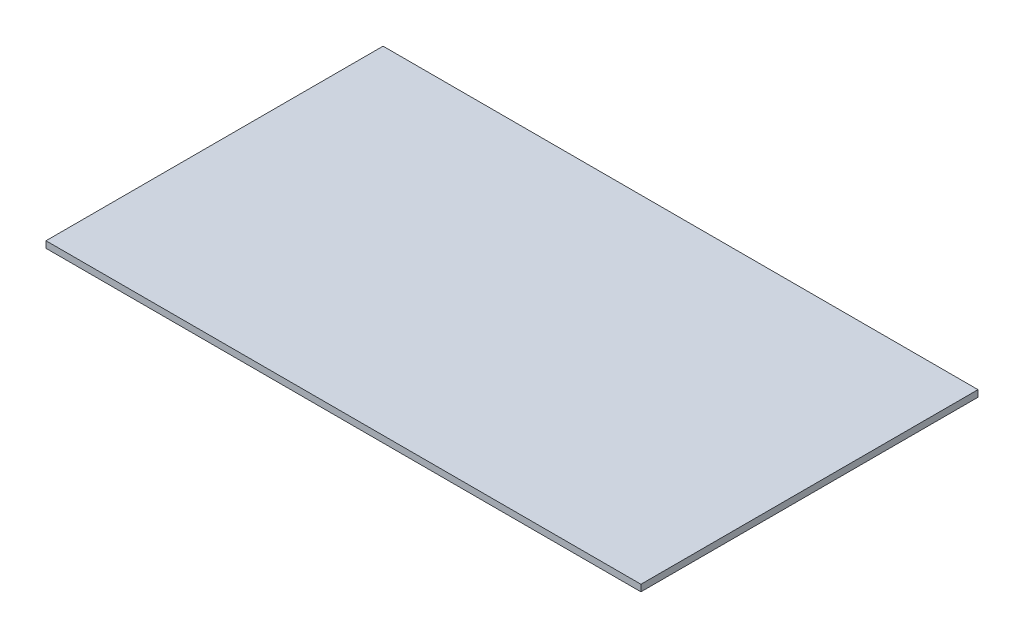
ISO-10303-21;
HEADER;
FILE_DESCRIPTION(('STEP AP214'),'2;1');
FILE_NAME('part.step','',(''),(''),'','','');
FILE_SCHEMA(('AUTOMOTIVE_DESIGN { 1 0 10303 214 1 1 1 1 }'));
ENDSEC;
DATA;
#1=APPLICATION_CONTEXT('core data for automotive mechanical design processes');
#2=APPLICATION_PROTOCOL_DEFINITION('international standard','automotive_design',2000,#1);
#3=PRODUCT_CONTEXT('',#1,'mechanical');
#4=PRODUCT('Part','Part','',(#3));
#5=PRODUCT_RELATED_PRODUCT_CATEGORY('part','',(#4));
#6=PRODUCT_DEFINITION_FORMATION('','',#4);
#7=PRODUCT_DEFINITION_CONTEXT('part definition',#1,'design');
#8=PRODUCT_DEFINITION('design','',#6,#7);
#9=PRODUCT_DEFINITION_SHAPE('','',#8);
#10=(LENGTH_UNIT() NAMED_UNIT(*) SI_UNIT(.MILLI.,.METRE.));
#11=(NAMED_UNIT(*) PLANE_ANGLE_UNIT() SI_UNIT($,.RADIAN.));
#12=(NAMED_UNIT(*) SI_UNIT($,.STERADIAN.) SOLID_ANGLE_UNIT());
#13=UNCERTAINTY_MEASURE_WITH_UNIT(LENGTH_MEASURE(1.E-05),#10,'distance_accuracy_value','');
#14=(GEOMETRIC_REPRESENTATION_CONTEXT(3) GLOBAL_UNCERTAINTY_ASSIGNED_CONTEXT((#13)) GLOBAL_UNIT_ASSIGNED_CONTEXT((#10,
#11,#12)) REPRESENTATION_CONTEXT('',''));
#15=CARTESIAN_POINT('',(0.,0.,0.));
#16=DIRECTION('',(0.,0.,1.));
#17=DIRECTION('',(1.,0.,0.));
#18=AXIS2_PLACEMENT_3D('',#15,#16,#17);
#19=CARTESIAN_POINT('',(143.181070000001,-1.58749999999998,162.23234));
#20=DIRECTION('',(-1.,0.,0.));
#21=DIRECTION('',(0.,0.,1.));
#22=AXIS2_PLACEMENT_3D('',#19,#20,#21);
#23=PLANE('',#22);
#24=DIRECTION('',(0.,1.,0.));
#25=VECTOR('',#24,1.);
#26=CARTESIAN_POINT('',(143.181070000001,-1.58749999999998,0.));
#27=LINE('',#26,#25);
#28=CARTESIAN_POINT('',(143.181070000001,-1.58749999999998,0.));
#29=VERTEX_POINT('',#28);
#30=CARTESIAN_POINT('',(143.181070000001,1.58750000000003,0.));
#31=VERTEX_POINT('',#30);
#32=EDGE_CURVE('E106',#29,#31,#27,.T.);
#33=ORIENTED_EDGE('',*,*,#32,.T.);
#34=DIRECTION('',(0.,0.,-1.));
#35=VECTOR('',#34,1.);
#36=CARTESIAN_POINT('',(143.181070000001,1.58750000000003,162.23234));
#37=LINE('',#36,#35);
#38=CARTESIAN_POINT('',(143.181070000001,1.58750000000003,162.23234));
#39=VERTEX_POINT('',#38);
#40=EDGE_CURVE('E11',#39,#31,#37,.T.);
#41=ORIENTED_EDGE('',*,*,#40,.F.);
#42=DIRECTION('',(0.,1.,0.));
#43=VECTOR('',#42,1.);
#44=CARTESIAN_POINT('',(143.181070000001,-1.58749999999998,162.23234));
#45=LINE('',#44,#43);
#46=CARTESIAN_POINT('',(143.181070000001,-1.58749999999998,162.23234));
#47=VERTEX_POINT('',#46);
#48=EDGE_CURVE('E94',#47,#39,#45,.T.);
#49=ORIENTED_EDGE('',*,*,#48,.F.);
#50=DIRECTION('',(0.,0.,-1.));
#51=VECTOR('',#50,1.);
#52=CARTESIAN_POINT('',(143.181070000001,-1.58749999999998,162.23234));
#53=LINE('',#52,#51);
#54=EDGE_CURVE('E102',#47,#29,#53,.T.);
#55=ORIENTED_EDGE('',*,*,#54,.T.);
#56=EDGE_LOOP('',(#33,#41,#49,#55));
#57=FACE_BOUND('',#56,.T.);
#58=ADVANCED_FACE('F43',(#57),#23,.F.);
#59=CARTESIAN_POINT('',(-143.181069999999,1.58750000000003,162.23234));
#60=DIRECTION('',(0.,-1.,0.));
#61=DIRECTION('',(0.,0.,-1.));
#62=AXIS2_PLACEMENT_3D('',#59,#60,#61);
#63=PLANE('',#62);
#64=DIRECTION('',(-1.,0.,0.));
#65=VECTOR('',#64,1.);
#66=CARTESIAN_POINT('',(-143.181069999999,1.58750000000003,0.));
#67=LINE('',#66,#65);
#68=CARTESIAN_POINT('',(-143.181069999999,1.58750000000003,0.));
#69=VERTEX_POINT('',#68);
#70=EDGE_CURVE('E98',#31,#69,#67,.T.);
#71=ORIENTED_EDGE('',*,*,#70,.T.);
#72=DIRECTION('',(0.,0.,-1.));
#73=VECTOR('',#72,1.);
#74=CARTESIAN_POINT('',(-143.181069999999,1.58750000000003,162.23234));
#75=LINE('',#74,#73);
#76=CARTESIAN_POINT('',(-143.181069999999,1.58750000000003,162.23234));
#77=VERTEX_POINT('',#76);
#78=EDGE_CURVE('E51',#77,#69,#75,.T.);
#79=ORIENTED_EDGE('',*,*,#78,.F.);
#80=DIRECTION('',(-1.,0.,0.));
#81=VECTOR('',#80,1.);
#82=CARTESIAN_POINT('',(-143.181069999999,1.58750000000003,162.23234));
#83=LINE('',#82,#81);
#84=EDGE_CURVE('E89',#39,#77,#83,.T.);
#85=ORIENTED_EDGE('',*,*,#84,.F.);
#86=ORIENTED_EDGE('',*,*,#40,.T.);
#87=EDGE_LOOP('',(#71,#79,#85,#86));
#88=FACE_BOUND('',#87,.T.);
#89=ADVANCED_FACE('F97',(#88),#63,.F.);
#90=CARTESIAN_POINT('',(-143.181069999999,-1.58749999999998,162.23234));
#91=DIRECTION('',(1.,0.,0.));
#92=DIRECTION('',(0.,0.,-1.));
#93=AXIS2_PLACEMENT_3D('',#90,#91,#92);
#94=PLANE('',#93);
#95=DIRECTION('',(0.,-1.,0.));
#96=VECTOR('',#95,1.);
#97=CARTESIAN_POINT('',(-143.181069999999,-1.58749999999998,0.));
#98=LINE('',#97,#96);
#99=CARTESIAN_POINT('',(-143.181069999999,-1.58749999999998,0.));
#100=VERTEX_POINT('',#99);
#101=EDGE_CURVE('E76',#69,#100,#98,.T.);
#102=ORIENTED_EDGE('',*,*,#101,.T.);
#103=DIRECTION('',(0.,0.,-1.));
#104=VECTOR('',#103,1.);
#105=CARTESIAN_POINT('',(-143.181069999999,-1.58749999999998,162.23234));
#106=LINE('',#105,#104);
#107=CARTESIAN_POINT('',(-143.181069999999,-1.58749999999998,162.23234));
#108=VERTEX_POINT('',#107);
#109=EDGE_CURVE('E99',#108,#100,#106,.T.);
#110=ORIENTED_EDGE('',*,*,#109,.F.);
#111=DIRECTION('',(0.,-1.,0.));
#112=VECTOR('',#111,1.);
#113=CARTESIAN_POINT('',(-143.181069999999,-1.58749999999998,162.23234));
#114=LINE('',#113,#112);
#115=EDGE_CURVE('E92',#77,#108,#114,.T.);
#116=ORIENTED_EDGE('',*,*,#115,.F.);
#117=ORIENTED_EDGE('',*,*,#78,.T.);
#118=EDGE_LOOP('',(#102,#110,#116,#117));
#119=FACE_BOUND('',#118,.T.);
#120=ADVANCED_FACE('F100',(#119),#94,.F.);
#121=CARTESIAN_POINT('',(-143.181069999999,-1.58749999999998,162.23234));
#122=DIRECTION('',(0.,1.,0.));
#123=DIRECTION('',(0.,0.,1.));
#124=AXIS2_PLACEMENT_3D('',#121,#122,#123);
#125=PLANE('',#124);
#126=DIRECTION('',(1.,0.,0.));
#127=VECTOR('',#126,1.);
#128=CARTESIAN_POINT('',(-143.181069999999,-1.58749999999998,0.));
#129=LINE('',#128,#127);
#130=EDGE_CURVE('E82',#100,#29,#129,.T.);
#131=ORIENTED_EDGE('',*,*,#130,.T.);
#132=ORIENTED_EDGE('',*,*,#54,.F.);
#133=DIRECTION('',(1.,0.,0.));
#134=VECTOR('',#133,1.);
#135=CARTESIAN_POINT('',(-143.181069999999,-1.58749999999998,162.23234));
#136=LINE('',#135,#134);
#137=EDGE_CURVE('E59',#108,#47,#136,.T.);
#138=ORIENTED_EDGE('',*,*,#137,.F.);
#139=ORIENTED_EDGE('',*,*,#109,.T.);
#140=EDGE_LOOP('',(#131,#132,#138,#139));
#141=FACE_BOUND('',#140,.T.);
#142=ADVANCED_FACE('F113',(#141),#125,.F.);
#143=CARTESIAN_POINT('',(0.,0.,162.23234));
#144=DIRECTION('',(0.,0.,-1.));
#145=DIRECTION('',(-1.,0.,0.));
#146=AXIS2_PLACEMENT_3D('',#143,#144,#145);
#147=PLANE('',#146);
#148=ORIENTED_EDGE('',*,*,#48,.T.);
#149=ORIENTED_EDGE('',*,*,#84,.T.);
#150=ORIENTED_EDGE('',*,*,#115,.T.);
#151=ORIENTED_EDGE('',*,*,#137,.T.);
#152=EDGE_LOOP('',(#148,#149,#150,#151));
#153=FACE_BOUND('',#152,.T.);
#154=ADVANCED_FACE('F90',(#153),#147,.F.);
#155=CARTESIAN_POINT('',(0.,0.,0.));
#156=DIRECTION('',(0.,0.,-1.));
#157=DIRECTION('',(-1.,0.,0.));
#158=AXIS2_PLACEMENT_3D('',#155,#156,#157);
#159=PLANE('',#158);
#160=ORIENTED_EDGE('',*,*,#32,.F.);
#161=ORIENTED_EDGE('',*,*,#130,.F.);
#162=ORIENTED_EDGE('',*,*,#101,.F.);
#163=ORIENTED_EDGE('',*,*,#70,.F.);
#164=EDGE_LOOP('',(#160,#161,#162,#163));
#165=FACE_BOUND('',#164,.T.);
#166=ADVANCED_FACE('F116',(#165),#159,.T.);
#167=CLOSED_SHELL('',(#58,#89,#120,#142,#154,#166));
#168=MANIFOLD_SOLID_BREP('B2',#167);
#169=ADVANCED_BREP_SHAPE_REPRESENTATION('',(#18,#168),#14);
#170=SHAPE_DEFINITION_REPRESENTATION(#9,#169);
ENDSEC;
END-ISO-10303-21;
